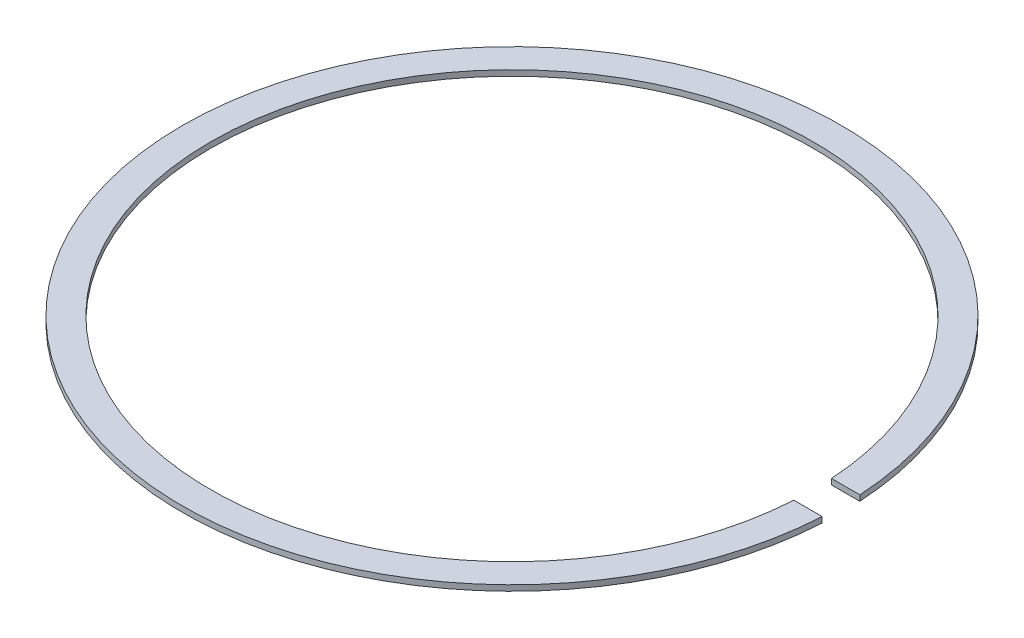
ISO-10303-21;
HEADER;
FILE_DESCRIPTION(('STEP AP214'),'2;1');
FILE_NAME('part.step','',(''),(''),'','','');
FILE_SCHEMA(('AUTOMOTIVE_DESIGN { 1 0 10303 214 1 1 1 1 }'));
ENDSEC;
DATA;
#1=APPLICATION_CONTEXT('core data for automotive mechanical design processes');
#2=APPLICATION_PROTOCOL_DEFINITION('international standard','automotive_design',2000,#1);
#3=PRODUCT_CONTEXT('',#1,'mechanical');
#4=PRODUCT('Part','Part','',(#3));
#5=PRODUCT_RELATED_PRODUCT_CATEGORY('part','',(#4));
#6=PRODUCT_DEFINITION_FORMATION('','',#4);
#7=PRODUCT_DEFINITION_CONTEXT('part definition',#1,'design');
#8=PRODUCT_DEFINITION('design','',#6,#7);
#9=PRODUCT_DEFINITION_SHAPE('','',#8);
#10=(LENGTH_UNIT() NAMED_UNIT(*) SI_UNIT(.MILLI.,.METRE.));
#11=(NAMED_UNIT(*) PLANE_ANGLE_UNIT() SI_UNIT($,.RADIAN.));
#12=(NAMED_UNIT(*) SI_UNIT($,.STERADIAN.) SOLID_ANGLE_UNIT());
#13=UNCERTAINTY_MEASURE_WITH_UNIT(LENGTH_MEASURE(1.E-05),#10,'distance_accuracy_value','');
#14=(GEOMETRIC_REPRESENTATION_CONTEXT(3) GLOBAL_UNCERTAINTY_ASSIGNED_CONTEXT((#13)) GLOBAL_UNIT_ASSIGNED_CONTEXT((#10,
#11,#12)) REPRESENTATION_CONTEXT('',''));
#15=CARTESIAN_POINT('',(0.,0.,0.));
#16=DIRECTION('',(0.,0.,1.));
#17=DIRECTION('',(1.,0.,0.));
#18=AXIS2_PLACEMENT_3D('',#15,#16,#17);
#19=CARTESIAN_POINT('',(0.,1.5,0.));
#20=DIRECTION('',(0.,1.,0.));
#21=DIRECTION('',(0.,0.,1.));
#22=AXIS2_PLACEMENT_3D('',#19,#20,#21);
#23=PLANE('',#22);
#24=DIRECTION('',(-1.,0.,0.));
#25=VECTOR('',#24,1.);
#26=CARTESIAN_POINT('',(183.804563233898,1.5,-10.));
#27=LINE('',#26,#25);
#28=CARTESIAN_POINT('',(174.714052096561,1.5,-10.));
#29=VERTEX_POINT('',#28);
#30=CARTESIAN_POINT('',(159.687194226713,1.5,-10.));
#31=VERTEX_POINT('',#30);
#32=EDGE_CURVE('E54',#29,#31,#27,.T.);
#33=ORIENTED_EDGE('',*,*,#32,.F.);
#34=CARTESIAN_POINT('',(0.,1.5,0.));
#35=DIRECTION('',(0.,1.,0.));
#36=DIRECTION('',(0.,0.,1.));
#37=AXIS2_PLACEMENT_3D('',#34,#35,#36);
#38=CIRCLE('',#37,175.);
#39=CARTESIAN_POINT('',(174.714052096561,1.5,10.));
#40=VERTEX_POINT('',#39);
#41=EDGE_CURVE('E77',#29,#40,#38,.T.);
#42=ORIENTED_EDGE('',*,*,#41,.T.);
#43=DIRECTION('',(1.,0.,0.));
#44=VECTOR('',#43,1.);
#45=CARTESIAN_POINT('',(183.804563233898,1.5,10.));
#46=LINE('',#45,#44);
#47=CARTESIAN_POINT('',(159.687194226713,1.5,10.));
#48=VERTEX_POINT('',#47);
#49=EDGE_CURVE('E71',#48,#40,#46,.T.);
#50=ORIENTED_EDGE('',*,*,#49,.F.);
#51=CARTESIAN_POINT('',(0.,1.5,0.));
#52=DIRECTION('',(0.,1.,0.));
#53=DIRECTION('',(0.,0.,1.));
#54=AXIS2_PLACEMENT_3D('',#51,#52,#53);
#55=CIRCLE('',#54,160.);
#56=EDGE_CURVE('E81',#31,#48,#55,.T.);
#57=ORIENTED_EDGE('',*,*,#56,.F.);
#58=EDGE_LOOP('',(#33,#42,#50,#57));
#59=FACE_BOUND('',#58,.T.);
#60=ADVANCED_FACE('F32',(#59),#23,.T.);
#61=CARTESIAN_POINT('',(0.,-1.5,0.));
#62=DIRECTION('',(0.,1.,0.));
#63=DIRECTION('',(0.,0.,1.));
#64=AXIS2_PLACEMENT_3D('',#61,#62,#63);
#65=PLANE('',#64);
#66=CARTESIAN_POINT('',(0.,-1.5,0.));
#67=DIRECTION('',(0.,1.,0.));
#68=DIRECTION('',(0.,0.,1.));
#69=AXIS2_PLACEMENT_3D('',#66,#67,#68);
#70=CIRCLE('',#69,175.);
#71=CARTESIAN_POINT('',(174.714052096561,-1.5,-10.));
#72=VERTEX_POINT('',#71);
#73=CARTESIAN_POINT('',(174.714052096561,-1.5,10.));
#74=VERTEX_POINT('',#73);
#75=EDGE_CURVE('E85',#72,#74,#70,.T.);
#76=ORIENTED_EDGE('',*,*,#75,.F.);
#77=DIRECTION('',(-1.,0.,0.));
#78=VECTOR('',#77,1.);
#79=CARTESIAN_POINT('',(183.804563233898,-1.5,-10.));
#80=LINE('',#79,#78);
#81=CARTESIAN_POINT('',(159.687194226713,-1.5,-10.));
#82=VERTEX_POINT('',#81);
#83=EDGE_CURVE('E98',#72,#82,#80,.T.);
#84=ORIENTED_EDGE('',*,*,#83,.T.);
#85=CARTESIAN_POINT('',(0.,-1.5,0.));
#86=DIRECTION('',(0.,1.,0.));
#87=DIRECTION('',(0.,0.,1.));
#88=AXIS2_PLACEMENT_3D('',#85,#86,#87);
#89=CIRCLE('',#88,160.);
#90=CARTESIAN_POINT('',(159.687194226713,-1.5,10.));
#91=VERTEX_POINT('',#90);
#92=EDGE_CURVE('E86',#82,#91,#89,.T.);
#93=ORIENTED_EDGE('',*,*,#92,.T.);
#94=DIRECTION('',(1.,0.,0.));
#95=VECTOR('',#94,1.);
#96=CARTESIAN_POINT('',(183.804563233898,-1.5,10.));
#97=LINE('',#96,#95);
#98=EDGE_CURVE('E47',#91,#74,#97,.T.);
#99=ORIENTED_EDGE('',*,*,#98,.T.);
#100=EDGE_LOOP('',(#76,#84,#93,#99));
#101=FACE_BOUND('',#100,.T.);
#102=ADVANCED_FACE('F104',(#101),#65,.F.);
#103=CARTESIAN_POINT('',(0.,1.5,0.));
#104=DIRECTION('',(0.,-1.,0.));
#105=DIRECTION('',(0.,0.,-1.));
#106=AXIS2_PLACEMENT_3D('',#103,#104,#105);
#107=CYLINDRICAL_SURFACE('',#106,175.);
#108=ORIENTED_EDGE('',*,*,#41,.F.);
#109=DIRECTION('',(0.,-1.,0.));
#110=VECTOR('',#109,1.);
#111=CARTESIAN_POINT('',(174.714052096561,1.5,-10.));
#112=LINE('',#111,#110);
#113=EDGE_CURVE('E90',#29,#72,#112,.T.);
#114=ORIENTED_EDGE('',*,*,#113,.T.);
#115=ORIENTED_EDGE('',*,*,#75,.T.);
#116=DIRECTION('',(0.,-1.,0.));
#117=VECTOR('',#116,1.);
#118=CARTESIAN_POINT('',(174.714052096561,1.5,10.));
#119=LINE('',#118,#117);
#120=EDGE_CURVE('E96',#74,#40,#119,.F.);
#121=ORIENTED_EDGE('',*,*,#120,.T.);
#122=EDGE_LOOP('',(#108,#114,#115,#121));
#123=FACE_BOUND('',#122,.T.);
#124=ADVANCED_FACE('F34',(#123),#107,.T.);
#125=CARTESIAN_POINT('',(0.,1.5,0.));
#126=DIRECTION('',(0.,-1.,0.));
#127=DIRECTION('',(0.,0.,-1.));
#128=AXIS2_PLACEMENT_3D('',#125,#126,#127);
#129=CYLINDRICAL_SURFACE('',#128,160.);
#130=DIRECTION('',(0.,-1.,0.));
#131=VECTOR('',#130,1.);
#132=CARTESIAN_POINT('',(159.687194226713,1.5,-10.));
#133=LINE('',#132,#131);
#134=EDGE_CURVE('E11',#31,#82,#133,.T.);
#135=ORIENTED_EDGE('',*,*,#134,.F.);
#136=ORIENTED_EDGE('',*,*,#56,.T.);
#137=DIRECTION('',(0.,-1.,0.));
#138=VECTOR('',#137,1.);
#139=CARTESIAN_POINT('',(159.687194226713,1.5,10.));
#140=LINE('',#139,#138);
#141=EDGE_CURVE('E40',#91,#48,#140,.F.);
#142=ORIENTED_EDGE('',*,*,#141,.F.);
#143=ORIENTED_EDGE('',*,*,#92,.F.);
#144=EDGE_LOOP('',(#135,#136,#142,#143));
#145=FACE_BOUND('',#144,.T.);
#146=ADVANCED_FACE('F84',(#145),#129,.F.);
#147=CARTESIAN_POINT('',(183.804563233898,-1.5,10.));
#148=DIRECTION('',(0.,0.,1.));
#149=DIRECTION('',(1.,0.,0.));
#150=AXIS2_PLACEMENT_3D('',#147,#148,#149);
#151=PLANE('',#150);
#152=ORIENTED_EDGE('',*,*,#98,.F.);
#153=ORIENTED_EDGE('',*,*,#141,.T.);
#154=ORIENTED_EDGE('',*,*,#49,.T.);
#155=ORIENTED_EDGE('',*,*,#120,.F.);
#156=EDGE_LOOP('',(#152,#153,#154,#155));
#157=FACE_BOUND('',#156,.T.);
#158=ADVANCED_FACE('F70',(#157),#151,.F.);
#159=CARTESIAN_POINT('',(183.804563233898,-1.5,-10.));
#160=DIRECTION('',(0.,0.,-1.));
#161=DIRECTION('',(-1.,0.,0.));
#162=AXIS2_PLACEMENT_3D('',#159,#160,#161);
#163=PLANE('',#162);
#164=ORIENTED_EDGE('',*,*,#32,.T.);
#165=ORIENTED_EDGE('',*,*,#134,.T.);
#166=ORIENTED_EDGE('',*,*,#83,.F.);
#167=ORIENTED_EDGE('',*,*,#113,.F.);
#168=EDGE_LOOP('',(#164,#165,#166,#167));
#169=FACE_BOUND('',#168,.T.);
#170=ADVANCED_FACE('F106',(#169),#163,.F.);
#171=CLOSED_SHELL('',(#60,#102,#124,#146,#158,#170));
#172=MANIFOLD_SOLID_BREP('B2',#171);
#173=ADVANCED_BREP_SHAPE_REPRESENTATION('',(#18,#172),#14);
#174=SHAPE_DEFINITION_REPRESENTATION(#9,#173);
ENDSEC;
END-ISO-10303-21;
